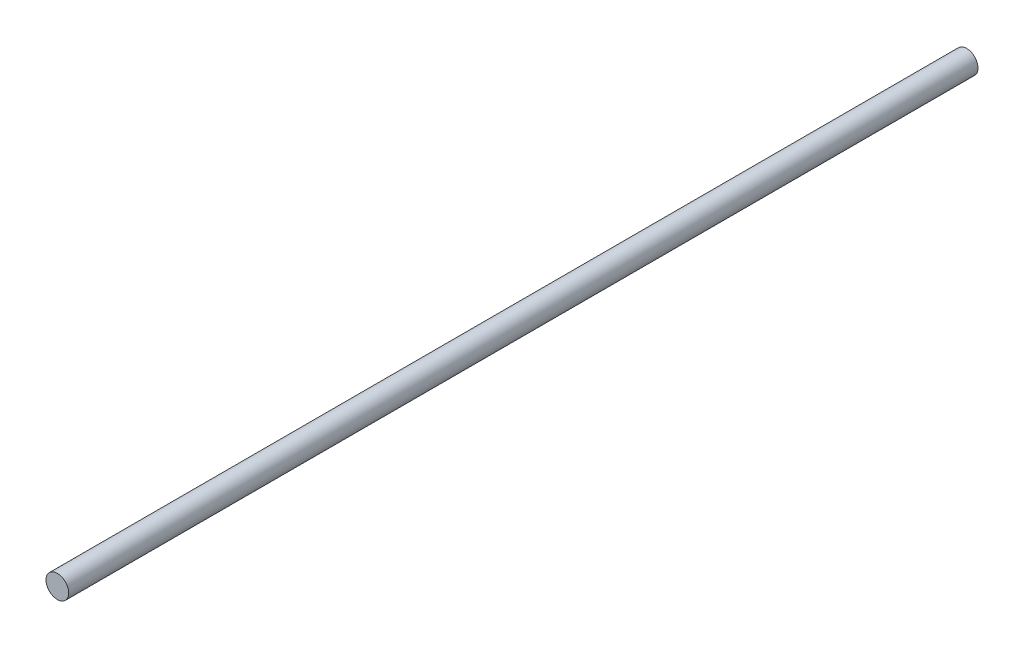
ISO-10303-21;
HEADER;
FILE_DESCRIPTION(('STEP AP214'),'2;1');
FILE_NAME('part.step','',(''),(''),'','','');
FILE_SCHEMA(('AUTOMOTIVE_DESIGN { 1 0 10303 214 1 1 1 1 }'));
ENDSEC;
DATA;
#1=APPLICATION_CONTEXT('core data for automotive mechanical design processes');
#2=APPLICATION_PROTOCOL_DEFINITION('international standard','automotive_design',2000,#1);
#3=PRODUCT_CONTEXT('',#1,'mechanical');
#4=PRODUCT('Part','Part','',(#3));
#5=PRODUCT_RELATED_PRODUCT_CATEGORY('part','',(#4));
#6=PRODUCT_DEFINITION_FORMATION('','',#4);
#7=PRODUCT_DEFINITION_CONTEXT('part definition',#1,'design');
#8=PRODUCT_DEFINITION('design','',#6,#7);
#9=PRODUCT_DEFINITION_SHAPE('','',#8);
#10=(LENGTH_UNIT() NAMED_UNIT(*) SI_UNIT(.MILLI.,.METRE.));
#11=(NAMED_UNIT(*) PLANE_ANGLE_UNIT() SI_UNIT($,.RADIAN.));
#12=(NAMED_UNIT(*) SI_UNIT($,.STERADIAN.) SOLID_ANGLE_UNIT());
#13=UNCERTAINTY_MEASURE_WITH_UNIT(LENGTH_MEASURE(1.E-05),#10,'distance_accuracy_value','');
#14=(GEOMETRIC_REPRESENTATION_CONTEXT(3) GLOBAL_UNCERTAINTY_ASSIGNED_CONTEXT((#13)) GLOBAL_UNIT_ASSIGNED_CONTEXT((#10,
#11,#12)) REPRESENTATION_CONTEXT('',''));
#15=CARTESIAN_POINT('',(0.,0.,0.));
#16=DIRECTION('',(0.,0.,1.));
#17=DIRECTION('',(1.,0.,0.));
#18=AXIS2_PLACEMENT_3D('',#15,#16,#17);
#19=CARTESIAN_POINT('',(0.,0.,254.));
#20=DIRECTION('',(0.,0.,-1.));
#21=DIRECTION('',(-1.,0.,0.));
#22=AXIS2_PLACEMENT_3D('',#19,#20,#21);
#23=CYLINDRICAL_SURFACE('',#22,6.35);
#24=CARTESIAN_POINT('',(0.,0.,254.));
#25=DIRECTION('',(0.,0.,1.));
#26=DIRECTION('',(1.,0.,0.));
#27=AXIS2_PLACEMENT_3D('',#24,#25,#26);
#28=CIRCLE('',#27,6.35);
#29=CARTESIAN_POINT('',(6.35,0.,254.));
#30=VERTEX_POINT('',#29);
#31=EDGE_CURVE('E10',#30,#30,#28,.T.);
#32=ORIENTED_EDGE('',*,*,#31,.F.);
#33=EDGE_LOOP('',(#32));
#34=FACE_BOUND('',#33,.T.);
#35=CARTESIAN_POINT('',(0.,0.,-254.));
#36=DIRECTION('',(0.,0.,1.));
#37=DIRECTION('',(1.,0.,0.));
#38=AXIS2_PLACEMENT_3D('',#35,#36,#37);
#39=CIRCLE('',#38,6.35);
#40=CARTESIAN_POINT('',(6.35,0.,-254.));
#41=VERTEX_POINT('',#40);
#42=EDGE_CURVE('E33',#41,#41,#39,.T.);
#43=ORIENTED_EDGE('',*,*,#42,.T.);
#44=EDGE_LOOP('',(#43));
#45=FACE_BOUND('',#44,.T.);
#46=ADVANCED_FACE('F30',(#34,#45),#23,.T.);
#47=CARTESIAN_POINT('',(0.,0.,254.));
#48=DIRECTION('',(0.,0.,1.));
#49=DIRECTION('',(1.,0.,0.));
#50=AXIS2_PLACEMENT_3D('',#47,#48,#49);
#51=PLANE('',#50);
#52=ORIENTED_EDGE('',*,*,#31,.T.);
#53=EDGE_LOOP('',(#52));
#54=FACE_BOUND('',#53,.T.);
#55=ADVANCED_FACE('F45',(#54),#51,.T.);
#56=CARTESIAN_POINT('',(0.,0.,-254.));
#57=DIRECTION('',(0.,0.,1.));
#58=DIRECTION('',(1.,0.,0.));
#59=AXIS2_PLACEMENT_3D('',#56,#57,#58);
#60=PLANE('',#59);
#61=ORIENTED_EDGE('',*,*,#42,.F.);
#62=EDGE_LOOP('',(#61));
#63=FACE_BOUND('',#62,.T.);
#64=ADVANCED_FACE('F43',(#63),#60,.F.);
#65=CLOSED_SHELL('',(#46,#55,#64));
#66=MANIFOLD_SOLID_BREP('B2',#65);
#67=ADVANCED_BREP_SHAPE_REPRESENTATION('',(#18,#66),#14);
#68=SHAPE_DEFINITION_REPRESENTATION(#9,#67);
ENDSEC;
END-ISO-10303-21;
